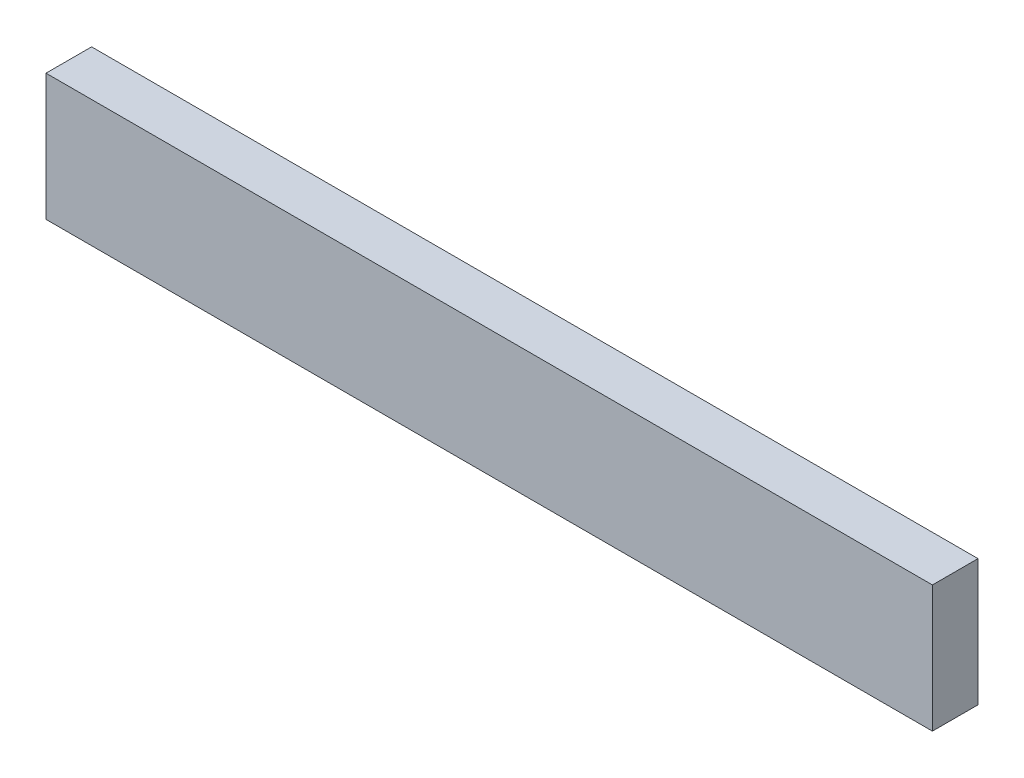
ISO-10303-21;
HEADER;
FILE_DESCRIPTION(('STEP AP214'),'2;1');
FILE_NAME('part.step','',(''),(''),'','','');
FILE_SCHEMA(('AUTOMOTIVE_DESIGN { 1 0 10303 214 1 1 1 1 }'));
ENDSEC;
DATA;
#1=APPLICATION_CONTEXT('core data for automotive mechanical design processes');
#2=APPLICATION_PROTOCOL_DEFINITION('international standard','automotive_design',2000,#1);
#3=PRODUCT_CONTEXT('',#1,'mechanical');
#4=PRODUCT('Part','Part','',(#3));
#5=PRODUCT_RELATED_PRODUCT_CATEGORY('part','',(#4));
#6=PRODUCT_DEFINITION_FORMATION('','',#4);
#7=PRODUCT_DEFINITION_CONTEXT('part definition',#1,'design');
#8=PRODUCT_DEFINITION('design','',#6,#7);
#9=PRODUCT_DEFINITION_SHAPE('','',#8);
#10=(LENGTH_UNIT() NAMED_UNIT(*) SI_UNIT(.MILLI.,.METRE.));
#11=(NAMED_UNIT(*) PLANE_ANGLE_UNIT() SI_UNIT($,.RADIAN.));
#12=(NAMED_UNIT(*) SI_UNIT($,.STERADIAN.) SOLID_ANGLE_UNIT());
#13=UNCERTAINTY_MEASURE_WITH_UNIT(LENGTH_MEASURE(1.E-05),#10,'distance_accuracy_value','');
#14=(GEOMETRIC_REPRESENTATION_CONTEXT(3) GLOBAL_UNCERTAINTY_ASSIGNED_CONTEXT((#13)) GLOBAL_UNIT_ASSIGNED_CONTEXT((#10,
#11,#12)) REPRESENTATION_CONTEXT('',''));
#15=CARTESIAN_POINT('',(0.,0.,0.));
#16=DIRECTION('',(0.,0.,1.));
#17=DIRECTION('',(1.,0.,0.));
#18=AXIS2_PLACEMENT_3D('',#15,#16,#17);
#19=CARTESIAN_POINT('',(0.,0.,18.));
#20=DIRECTION('',(1.,0.,0.));
#21=DIRECTION('',(0.,0.,-1.));
#22=AXIS2_PLACEMENT_3D('',#19,#20,#21);
#23=PLANE('',#22);
#24=DIRECTION('',(0.,-1.,0.));
#25=VECTOR('',#24,1.);
#26=CARTESIAN_POINT('',(0.,0.,0.));
#27=LINE('',#26,#25);
#28=CARTESIAN_POINT('',(0.,50.,0.));
#29=VERTEX_POINT('',#28);
#30=CARTESIAN_POINT('',(0.,0.,0.));
#31=VERTEX_POINT('',#30);
#32=EDGE_CURVE('E96',#29,#31,#27,.T.);
#33=ORIENTED_EDGE('',*,*,#32,.T.);
#34=DIRECTION('',(0.,0.,-1.));
#35=VECTOR('',#34,1.);
#36=CARTESIAN_POINT('',(0.,0.,18.));
#37=LINE('',#36,#35);
#38=CARTESIAN_POINT('',(0.,0.,18.));
#39=VERTEX_POINT('',#38);
#40=EDGE_CURVE('E11',#39,#31,#37,.T.);
#41=ORIENTED_EDGE('',*,*,#40,.F.);
#42=DIRECTION('',(0.,-1.,0.));
#43=VECTOR('',#42,1.);
#44=CARTESIAN_POINT('',(0.,0.,18.));
#45=LINE('',#44,#43);
#46=CARTESIAN_POINT('',(0.,50.,18.));
#47=VERTEX_POINT('',#46);
#48=EDGE_CURVE('E84',#47,#39,#45,.T.);
#49=ORIENTED_EDGE('',*,*,#48,.F.);
#50=DIRECTION('',(0.,0.,-1.));
#51=VECTOR('',#50,1.);
#52=CARTESIAN_POINT('',(0.,50.,18.));
#53=LINE('',#52,#51);
#54=EDGE_CURVE('E92',#47,#29,#53,.T.);
#55=ORIENTED_EDGE('',*,*,#54,.T.);
#56=EDGE_LOOP('',(#33,#41,#49,#55));
#57=FACE_BOUND('',#56,.T.);
#58=ADVANCED_FACE('F33',(#57),#23,.F.);
#59=CARTESIAN_POINT('',(0.,0.,18.));
#60=DIRECTION('',(0.,1.,0.));
#61=DIRECTION('',(0.,0.,1.));
#62=AXIS2_PLACEMENT_3D('',#59,#60,#61);
#63=PLANE('',#62);
#64=DIRECTION('',(1.,0.,0.));
#65=VECTOR('',#64,1.);
#66=CARTESIAN_POINT('',(0.,0.,0.));
#67=LINE('',#66,#65);
#68=CARTESIAN_POINT('',(350.,0.,0.));
#69=VERTEX_POINT('',#68);
#70=EDGE_CURVE('E88',#31,#69,#67,.T.);
#71=ORIENTED_EDGE('',*,*,#70,.T.);
#72=DIRECTION('',(0.,0.,-1.));
#73=VECTOR('',#72,1.);
#74=CARTESIAN_POINT('',(350.,0.,18.));
#75=LINE('',#74,#73);
#76=CARTESIAN_POINT('',(350.,0.,18.));
#77=VERTEX_POINT('',#76);
#78=EDGE_CURVE('E41',#77,#69,#75,.T.);
#79=ORIENTED_EDGE('',*,*,#78,.F.);
#80=DIRECTION('',(1.,0.,0.));
#81=VECTOR('',#80,1.);
#82=CARTESIAN_POINT('',(0.,0.,18.));
#83=LINE('',#82,#81);
#84=EDGE_CURVE('E79',#39,#77,#83,.T.);
#85=ORIENTED_EDGE('',*,*,#84,.F.);
#86=ORIENTED_EDGE('',*,*,#40,.T.);
#87=EDGE_LOOP('',(#71,#79,#85,#86));
#88=FACE_BOUND('',#87,.T.);
#89=ADVANCED_FACE('F87',(#88),#63,.F.);
#90=CARTESIAN_POINT('',(350.,0.,18.));
#91=DIRECTION('',(-1.,0.,0.));
#92=DIRECTION('',(0.,0.,1.));
#93=AXIS2_PLACEMENT_3D('',#90,#91,#92);
#94=PLANE('',#93);
#95=DIRECTION('',(0.,1.,0.));
#96=VECTOR('',#95,1.);
#97=CARTESIAN_POINT('',(350.,0.,0.));
#98=LINE('',#97,#96);
#99=CARTESIAN_POINT('',(350.,50.,0.));
#100=VERTEX_POINT('',#99);
#101=EDGE_CURVE('E66',#69,#100,#98,.T.);
#102=ORIENTED_EDGE('',*,*,#101,.T.);
#103=DIRECTION('',(0.,0.,-1.));
#104=VECTOR('',#103,1.);
#105=CARTESIAN_POINT('',(350.,50.,18.));
#106=LINE('',#105,#104);
#107=CARTESIAN_POINT('',(350.,50.,18.));
#108=VERTEX_POINT('',#107);
#109=EDGE_CURVE('E89',#108,#100,#106,.T.);
#110=ORIENTED_EDGE('',*,*,#109,.F.);
#111=DIRECTION('',(0.,1.,0.));
#112=VECTOR('',#111,1.);
#113=CARTESIAN_POINT('',(350.,0.,18.));
#114=LINE('',#113,#112);
#115=EDGE_CURVE('E82',#77,#108,#114,.T.);
#116=ORIENTED_EDGE('',*,*,#115,.F.);
#117=ORIENTED_EDGE('',*,*,#78,.T.);
#118=EDGE_LOOP('',(#102,#110,#116,#117));
#119=FACE_BOUND('',#118,.T.);
#120=ADVANCED_FACE('F90',(#119),#94,.F.);
#121=CARTESIAN_POINT('',(0.,50.,18.));
#122=DIRECTION('',(0.,-1.,0.));
#123=DIRECTION('',(0.,0.,-1.));
#124=AXIS2_PLACEMENT_3D('',#121,#122,#123);
#125=PLANE('',#124);
#126=DIRECTION('',(-1.,0.,0.));
#127=VECTOR('',#126,1.);
#128=CARTESIAN_POINT('',(0.,50.,0.));
#129=LINE('',#128,#127);
#130=EDGE_CURVE('E72',#100,#29,#129,.T.);
#131=ORIENTED_EDGE('',*,*,#130,.T.);
#132=ORIENTED_EDGE('',*,*,#54,.F.);
#133=DIRECTION('',(-1.,0.,0.));
#134=VECTOR('',#133,1.);
#135=CARTESIAN_POINT('',(0.,50.,18.));
#136=LINE('',#135,#134);
#137=EDGE_CURVE('E49',#108,#47,#136,.T.);
#138=ORIENTED_EDGE('',*,*,#137,.F.);
#139=ORIENTED_EDGE('',*,*,#109,.T.);
#140=EDGE_LOOP('',(#131,#132,#138,#139));
#141=FACE_BOUND('',#140,.T.);
#142=ADVANCED_FACE('F103',(#141),#125,.F.);
#143=CARTESIAN_POINT('',(0.,0.,18.));
#144=DIRECTION('',(0.,0.,-1.));
#145=DIRECTION('',(-1.,0.,0.));
#146=AXIS2_PLACEMENT_3D('',#143,#144,#145);
#147=PLANE('',#146);
#148=ORIENTED_EDGE('',*,*,#48,.T.);
#149=ORIENTED_EDGE('',*,*,#84,.T.);
#150=ORIENTED_EDGE('',*,*,#115,.T.);
#151=ORIENTED_EDGE('',*,*,#137,.T.);
#152=EDGE_LOOP('',(#148,#149,#150,#151));
#153=FACE_BOUND('',#152,.T.);
#154=ADVANCED_FACE('F80',(#153),#147,.F.);
#155=CARTESIAN_POINT('',(0.,0.,0.));
#156=DIRECTION('',(0.,0.,-1.));
#157=DIRECTION('',(-1.,0.,0.));
#158=AXIS2_PLACEMENT_3D('',#155,#156,#157);
#159=PLANE('',#158);
#160=ORIENTED_EDGE('',*,*,#32,.F.);
#161=ORIENTED_EDGE('',*,*,#130,.F.);
#162=ORIENTED_EDGE('',*,*,#101,.F.);
#163=ORIENTED_EDGE('',*,*,#70,.F.);
#164=EDGE_LOOP('',(#160,#161,#162,#163));
#165=FACE_BOUND('',#164,.T.);
#166=ADVANCED_FACE('F106',(#165),#159,.T.);
#167=CLOSED_SHELL('',(#58,#89,#120,#142,#154,#166));
#168=MANIFOLD_SOLID_BREP('B2',#167);
#169=ADVANCED_BREP_SHAPE_REPRESENTATION('',(#18,#168),#14);
#170=SHAPE_DEFINITION_REPRESENTATION(#9,#169);
ENDSEC;
END-ISO-10303-21;
